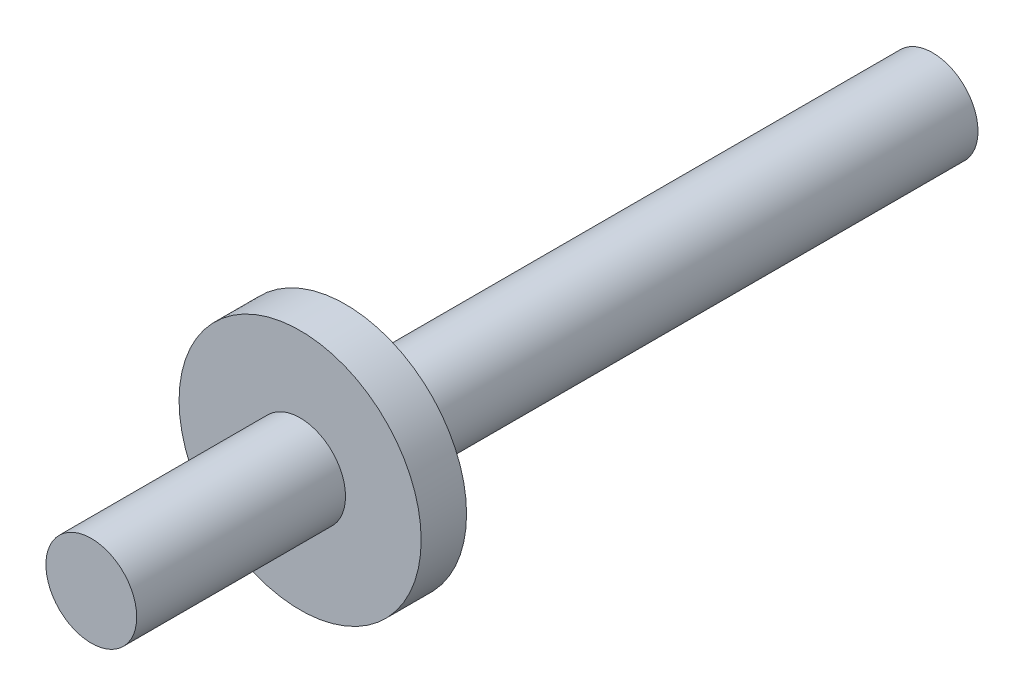
ISO-10303-21;
HEADER;
FILE_DESCRIPTION(('STEP AP214'),'2;1');
FILE_NAME('part.step','',(''),(''),'','','');
FILE_SCHEMA(('AUTOMOTIVE_DESIGN { 1 0 10303 214 1 1 1 1 }'));
ENDSEC;
DATA;
#1=APPLICATION_CONTEXT('core data for automotive mechanical design processes');
#2=APPLICATION_PROTOCOL_DEFINITION('international standard','automotive_design',2000,#1);
#3=PRODUCT_CONTEXT('',#1,'mechanical');
#4=PRODUCT('Part','Part','',(#3));
#5=PRODUCT_RELATED_PRODUCT_CATEGORY('part','',(#4));
#6=PRODUCT_DEFINITION_FORMATION('','',#4);
#7=PRODUCT_DEFINITION_CONTEXT('part definition',#1,'design');
#8=PRODUCT_DEFINITION('design','',#6,#7);
#9=PRODUCT_DEFINITION_SHAPE('','',#8);
#10=(LENGTH_UNIT() NAMED_UNIT(*) SI_UNIT(.MILLI.,.METRE.));
#11=(NAMED_UNIT(*) PLANE_ANGLE_UNIT() SI_UNIT($,.RADIAN.));
#12=(NAMED_UNIT(*) SI_UNIT($,.STERADIAN.) SOLID_ANGLE_UNIT());
#13=UNCERTAINTY_MEASURE_WITH_UNIT(LENGTH_MEASURE(1.E-05),#10,'distance_accuracy_value','');
#14=(GEOMETRIC_REPRESENTATION_CONTEXT(3) GLOBAL_UNCERTAINTY_ASSIGNED_CONTEXT((#13)) GLOBAL_UNIT_ASSIGNED_CONTEXT((#10,
#11,#12)) REPRESENTATION_CONTEXT('',''));
#15=CARTESIAN_POINT('',(0.,0.,0.));
#16=DIRECTION('',(0.,0.,1.));
#17=DIRECTION('',(1.,0.,0.));
#18=AXIS2_PLACEMENT_3D('',#15,#16,#17);
#19=CARTESIAN_POINT('',(75.0000000000003,-1230.02704111889,15.));
#20=DIRECTION('',(0.,0.,-1.));
#21=DIRECTION('',(-1.,0.,0.));
#22=AXIS2_PLACEMENT_3D('',#19,#20,#21);
#23=CYLINDRICAL_SURFACE('',#22,40.);
#24=CARTESIAN_POINT('',(75.0000000000003,-1230.02704111889,15.));
#25=DIRECTION('',(0.,0.,1.));
#26=DIRECTION('',(1.,0.,0.));
#27=AXIS2_PLACEMENT_3D('',#24,#25,#26);
#28=CIRCLE('',#27,40.);
#29=CARTESIAN_POINT('',(115.,-1230.02704111889,15.));
#30=VERTEX_POINT('',#29);
#31=EDGE_CURVE('E44',#30,#30,#28,.T.);
#32=ORIENTED_EDGE('',*,*,#31,.F.);
#33=EDGE_LOOP('',(#32));
#34=FACE_BOUND('',#33,.T.);
#35=CARTESIAN_POINT('',(75.0000000000003,-1230.02704111889,0.));
#36=DIRECTION('',(0.,0.,1.));
#37=DIRECTION('',(1.,0.,0.));
#38=AXIS2_PLACEMENT_3D('',#35,#36,#37);
#39=CIRCLE('',#38,40.);
#40=CARTESIAN_POINT('',(115.,-1230.02704111889,0.));
#41=VERTEX_POINT('',#40);
#42=EDGE_CURVE('E49',#41,#41,#39,.T.);
#43=ORIENTED_EDGE('',*,*,#42,.T.);
#44=EDGE_LOOP('',(#43));
#45=FACE_BOUND('',#44,.T.);
#46=ADVANCED_FACE('F37',(#34,#45),#23,.T.);
#47=CARTESIAN_POINT('',(75.0000000000003,-1230.02704111889,15.));
#48=DIRECTION('',(0.,0.,1.));
#49=DIRECTION('',(1.,0.,0.));
#50=AXIS2_PLACEMENT_3D('',#47,#48,#49);
#51=PLANE('',#50);
#52=CARTESIAN_POINT('',(75.0000000000003,-1230.02704111889,15.));
#53=DIRECTION('',(0.,0.,1.));
#54=DIRECTION('',(1.,0.,0.));
#55=AXIS2_PLACEMENT_3D('',#52,#53,#54);
#56=CIRCLE('',#55,15.);
#57=CARTESIAN_POINT('',(90.0000000000003,-1230.02704111889,15.));
#58=VERTEX_POINT('',#57);
#59=EDGE_CURVE('E10',#58,#58,#56,.T.);
#60=ORIENTED_EDGE('',*,*,#59,.F.);
#61=EDGE_LOOP('',(#60));
#62=FACE_BOUND('',#61,.T.);
#63=ORIENTED_EDGE('',*,*,#31,.T.);
#64=EDGE_LOOP('',(#63));
#65=FACE_BOUND('',#64,.T.);
#66=ADVANCED_FACE('F82',(#62,#65),#51,.T.);
#67=CARTESIAN_POINT('',(75.0000000000003,-1230.02704111889,0.));
#68=DIRECTION('',(0.,0.,1.));
#69=DIRECTION('',(1.,0.,0.));
#70=AXIS2_PLACEMENT_3D('',#67,#68,#69);
#71=PLANE('',#70);
#72=CARTESIAN_POINT('',(75.0000000000003,-1230.02704111889,0.));
#73=DIRECTION('',(0.,0.,1.));
#74=DIRECTION('',(1.,0.,0.));
#75=AXIS2_PLACEMENT_3D('',#72,#73,#74);
#76=CIRCLE('',#75,15.);
#77=CARTESIAN_POINT('',(90.0000000000003,-1230.02704111889,0.));
#78=VERTEX_POINT('',#77);
#79=EDGE_CURVE('E40',#78,#78,#76,.T.);
#80=ORIENTED_EDGE('',*,*,#79,.T.);
#81=EDGE_LOOP('',(#80));
#82=FACE_BOUND('',#81,.T.);
#83=ORIENTED_EDGE('',*,*,#42,.F.);
#84=EDGE_LOOP('',(#83));
#85=FACE_BOUND('',#84,.T.);
#86=ADVANCED_FACE('F87',(#82,#85),#71,.F.);
#87=CARTESIAN_POINT('',(75.0000000000003,-1230.02704111889,-194.));
#88=DIRECTION('',(0.,0.,1.));
#89=DIRECTION('',(1.,0.,0.));
#90=AXIS2_PLACEMENT_3D('',#87,#88,#89);
#91=PLANE('',#90);
#92=CARTESIAN_POINT('',(75.0000000000003,-1230.02704111889,-194.));
#93=DIRECTION('',(0.,0.,1.));
#94=DIRECTION('',(1.,0.,0.));
#95=AXIS2_PLACEMENT_3D('',#92,#93,#94);
#96=CIRCLE('',#95,15.);
#97=CARTESIAN_POINT('',(90.0000000000003,-1230.02704111889,-194.));
#98=VERTEX_POINT('',#97);
#99=EDGE_CURVE('E52',#98,#98,#96,.T.);
#100=ORIENTED_EDGE('',*,*,#99,.F.);
#101=EDGE_LOOP('',(#100));
#102=FACE_BOUND('',#101,.T.);
#103=ADVANCED_FACE('F78',(#102),#91,.F.);
#104=CARTESIAN_POINT('',(75.0000000000003,-1230.02704111889,-194.));
#105=DIRECTION('',(0.,0.,1.));
#106=DIRECTION('',(1.,0.,0.));
#107=AXIS2_PLACEMENT_3D('',#104,#105,#106);
#108=CYLINDRICAL_SURFACE('',#107,15.);
#109=ORIENTED_EDGE('',*,*,#99,.T.);
#110=EDGE_LOOP('',(#109));
#111=FACE_BOUND('',#110,.T.);
#112=ORIENTED_EDGE('',*,*,#79,.F.);
#113=EDGE_LOOP('',(#112));
#114=FACE_BOUND('',#113,.T.);
#115=ADVANCED_FACE('F71',(#111,#114),#108,.T.);
#116=ORIENTED_EDGE('',*,*,#59,.T.);
#117=EDGE_LOOP('',(#116));
#118=FACE_BOUND('',#117,.T.);
#119=CARTESIAN_POINT('',(75.0000000000003,-1230.02704111889,84.));
#120=DIRECTION('',(0.,0.,1.));
#121=DIRECTION('',(1.,0.,0.));
#122=AXIS2_PLACEMENT_3D('',#119,#120,#121);
#123=CIRCLE('',#122,15.);
#124=CARTESIAN_POINT('',(90.0000000000003,-1230.02704111889,84.));
#125=VERTEX_POINT('',#124);
#126=EDGE_CURVE('E61',#125,#125,#123,.T.);
#127=ORIENTED_EDGE('',*,*,#126,.F.);
#128=EDGE_LOOP('',(#127));
#129=FACE_BOUND('',#128,.T.);
#130=ADVANCED_FACE('F69',(#118,#129),#108,.T.);
#131=CARTESIAN_POINT('',(75.0000000000003,-1230.02704111889,84.));
#132=DIRECTION('',(0.,0.,1.));
#133=DIRECTION('',(1.,0.,0.));
#134=AXIS2_PLACEMENT_3D('',#131,#132,#133);
#135=PLANE('',#134);
#136=ORIENTED_EDGE('',*,*,#126,.T.);
#137=EDGE_LOOP('',(#136));
#138=FACE_BOUND('',#137,.T.);
#139=ADVANCED_FACE('F67',(#138),#135,.T.);
#140=CLOSED_SHELL('',(#46,#66,#86,#103,#115,#130,#139));
#141=MANIFOLD_SOLID_BREP('B2',#140);
#142=ADVANCED_BREP_SHAPE_REPRESENTATION('',(#18,#141),#14);
#143=SHAPE_DEFINITION_REPRESENTATION(#9,#142);
ENDSEC;
END-ISO-10303-21;
